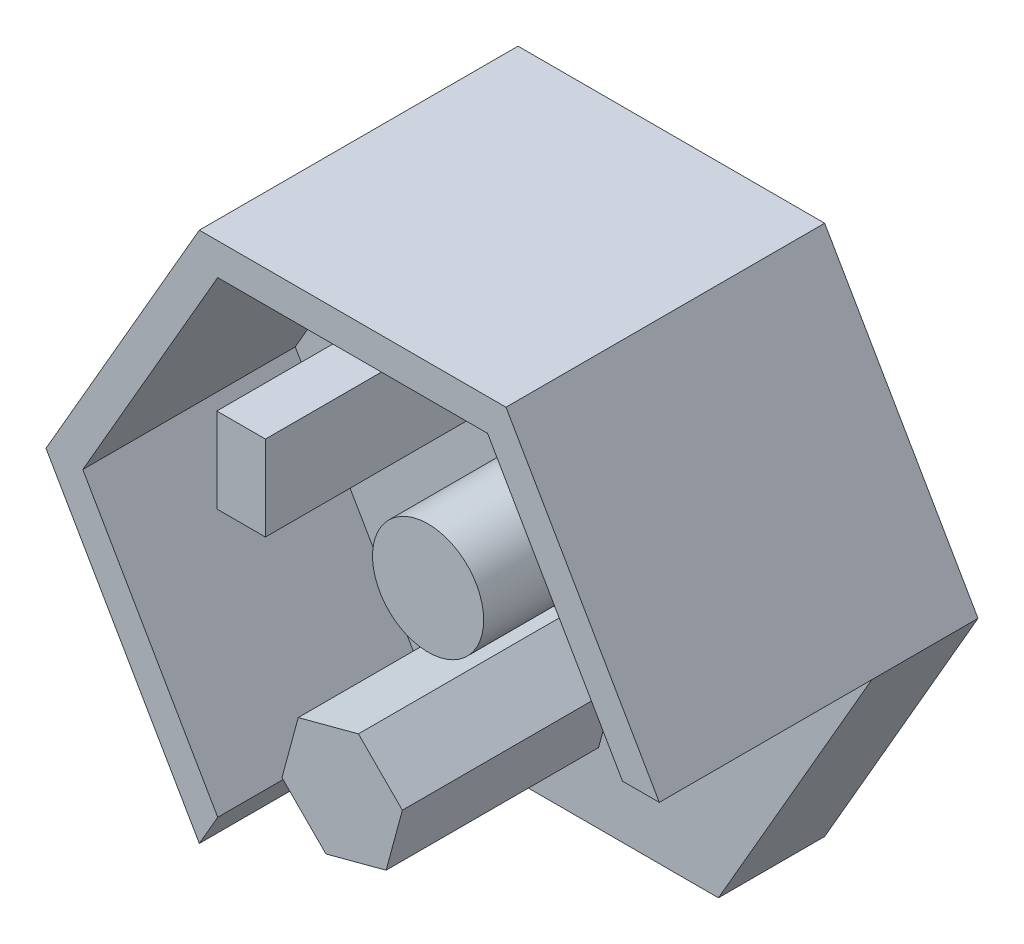
ISO-10303-21;
HEADER;
FILE_DESCRIPTION(('STEP AP214'),'2;1');
FILE_NAME('part.step','',(''),(''),'','','');
FILE_SCHEMA(('AUTOMOTIVE_DESIGN { 1 0 10303 214 1 1 1 1 }'));
ENDSEC;
DATA;
#1=APPLICATION_CONTEXT('core data for automotive mechanical design processes');
#2=APPLICATION_PROTOCOL_DEFINITION('international standard','automotive_design',2000,#1);
#3=PRODUCT_CONTEXT('',#1,'mechanical');
#4=PRODUCT('Part','Part','',(#3));
#5=PRODUCT_RELATED_PRODUCT_CATEGORY('part','',(#4));
#6=PRODUCT_DEFINITION_FORMATION('','',#4);
#7=PRODUCT_DEFINITION_CONTEXT('part definition',#1,'design');
#8=PRODUCT_DEFINITION('design','',#6,#7);
#9=PRODUCT_DEFINITION_SHAPE('','',#8);
#10=(LENGTH_UNIT() NAMED_UNIT(*) SI_UNIT(.MILLI.,.METRE.));
#11=(NAMED_UNIT(*) PLANE_ANGLE_UNIT() SI_UNIT($,.RADIAN.));
#12=(NAMED_UNIT(*) SI_UNIT($,.STERADIAN.) SOLID_ANGLE_UNIT());
#13=UNCERTAINTY_MEASURE_WITH_UNIT(LENGTH_MEASURE(1.E-05),#10,'distance_accuracy_value','');
#14=(GEOMETRIC_REPRESENTATION_CONTEXT(3) GLOBAL_UNCERTAINTY_ASSIGNED_CONTEXT((#13)) GLOBAL_UNIT_ASSIGNED_CONTEXT((#10,
#11,#12)) REPRESENTATION_CONTEXT('',''));
#15=CARTESIAN_POINT('',(0.,0.,0.));
#16=DIRECTION('',(0.,0.,1.));
#17=DIRECTION('',(1.,0.,0.));
#18=AXIS2_PLACEMENT_3D('',#15,#16,#17);
#19=CARTESIAN_POINT('',(0.,0.,100.));
#20=DIRECTION('',(0.,0.,1.));
#21=DIRECTION('',(1.,0.,0.));
#22=AXIS2_PLACEMENT_3D('',#19,#20,#21);
#23=PLANE('',#22);
#24=CARTESIAN_POINT('',(71.0000417790297,65.9084327447204,100.));
#25=DIRECTION('',(0.,0.,1.));
#26=DIRECTION('',(1.,0.,0.));
#27=AXIS2_PLACEMENT_3D('',#24,#25,#26);
#28=CIRCLE('',#27,52.3235089728572);
#29=CARTESIAN_POINT('',(123.323550751887,65.9084327447204,100.));
#30=VERTEX_POINT('',#29);
#31=EDGE_CURVE('E239',#30,#30,#28,.T.);
#32=ORIENTED_EDGE('',*,*,#31,.F.);
#33=EDGE_LOOP('',(#32));
#34=FACE_BOUND('',#33,.T.);
#35=DIRECTION('',(1.,0.,0.));
#36=VECTOR('',#35,1.);
#37=CARTESIAN_POINT('',(288.675134594813,0.,100.));
#38=LINE('',#37,#36);
#39=CARTESIAN_POINT('',(254.034118443435,0.,100.));
#40=VERTEX_POINT('',#39);
#41=CARTESIAN_POINT('',(288.675134594813,0.,100.));
#42=VERTEX_POINT('',#41);
#43=EDGE_CURVE('E246',#40,#42,#38,.T.);
#44=ORIENTED_EDGE('',*,*,#43,.F.);
#45=DIRECTION('',(-0.5,0.866025403784439,0.));
#46=VECTOR('',#45,1.);
#47=CARTESIAN_POINT('',(254.034118443435,0.,100.));
#48=LINE('',#47,#46);
#49=CARTESIAN_POINT('',(127.017059221718,220.,100.));
#50=VERTEX_POINT('',#49);
#51=EDGE_CURVE('E259',#40,#50,#48,.T.);
#52=ORIENTED_EDGE('',*,*,#51,.T.);
#53=DIRECTION('',(-1.,0.,0.));
#54=VECTOR('',#53,1.);
#55=CARTESIAN_POINT('',(127.017059221718,220.,100.));
#56=LINE('',#55,#54);
#57=CARTESIAN_POINT('',(-127.017059221718,220.,100.));
#58=VERTEX_POINT('',#57);
#59=EDGE_CURVE('E262',#50,#58,#56,.T.);
#60=ORIENTED_EDGE('',*,*,#59,.T.);
#61=DIRECTION('',(-0.5,-0.866025403784439,0.));
#62=VECTOR('',#61,1.);
#63=CARTESIAN_POINT('',(-127.017059221718,220.,100.));
#64=LINE('',#63,#62);
#65=CARTESIAN_POINT('',(-254.034118443435,-1.14350663860285E-13,100.));
#66=VERTEX_POINT('',#65);
#67=EDGE_CURVE('E266',#58,#66,#64,.T.);
#68=ORIENTED_EDGE('',*,*,#67,.T.);
#69=DIRECTION('',(0.5,-0.866025403784438,0.));
#70=VECTOR('',#69,1.);
#71=CARTESIAN_POINT('',(-254.034118443435,-1.14350663860285E-13,100.));
#72=LINE('',#71,#70);
#73=CARTESIAN_POINT('',(-127.017059221718,-220.,100.));
#74=VERTEX_POINT('',#73);
#75=EDGE_CURVE('E269',#66,#74,#72,.T.);
#76=ORIENTED_EDGE('',*,*,#75,.T.);
#77=DIRECTION('',(0.500000000000002,0.866025403784438,0.));
#78=VECTOR('',#77,1.);
#79=CARTESIAN_POINT('',(-127.017059221718,-220.,100.));
#80=LINE('',#79,#78);
#81=CARTESIAN_POINT('',(-144.337567297406,-250.,100.));
#82=VERTEX_POINT('',#81);
#83=EDGE_CURVE('E249',#82,#74,#80,.T.);
#84=ORIENTED_EDGE('',*,*,#83,.F.);
#85=DIRECTION('',(1.,0.,0.));
#86=VECTOR('',#85,1.);
#87=CARTESIAN_POINT('',(-144.337567297406,-250.,100.));
#88=LINE('',#87,#86);
#89=CARTESIAN_POINT('',(144.337567297406,-250.,100.));
#90=VERTEX_POINT('',#89);
#91=EDGE_CURVE('E256',#82,#90,#88,.T.);
#92=ORIENTED_EDGE('',*,*,#91,.T.);
#93=DIRECTION('',(0.5,0.866025403784439,0.));
#94=VECTOR('',#93,1.);
#95=CARTESIAN_POINT('',(144.337567297406,-250.,100.));
#96=LINE('',#95,#94);
#97=EDGE_CURVE('E254',#90,#42,#96,.T.);
#98=ORIENTED_EDGE('',*,*,#97,.T.);
#99=EDGE_LOOP('',(#44,#52,#60,#68,#76,#84,#92,#98));
#100=FACE_BOUND('',#99,.T.);
#101=DIRECTION('',(1.,0.,0.));
#102=VECTOR('',#101,1.);
#103=CARTESIAN_POINT('',(-127.873499512191,30.923794962689,100.));
#104=LINE('',#103,#102);
#105=CARTESIAN_POINT('',(-127.873499512191,30.923794962689,100.));
#106=VERTEX_POINT('',#105);
#107=CARTESIAN_POINT('',(-82.0971253509697,30.923794962689,100.));
#108=VERTEX_POINT('',#107);
#109=EDGE_CURVE('E210',#106,#108,#104,.T.);
#110=ORIENTED_EDGE('',*,*,#109,.F.);
#111=DIRECTION('',(0.,-1.,0.));
#112=VECTOR('',#111,1.);
#113=CARTESIAN_POINT('',(-127.873499512191,110.807978067157,100.));
#114=LINE('',#113,#112);
#115=CARTESIAN_POINT('',(-127.873499512191,110.807978067157,100.));
#116=VERTEX_POINT('',#115);
#117=EDGE_CURVE('E207',#116,#106,#114,.T.);
#118=ORIENTED_EDGE('',*,*,#117,.F.);
#119=DIRECTION('',(-1.,0.,0.));
#120=VECTOR('',#119,1.);
#121=CARTESIAN_POINT('',(-127.873499512191,110.807978067157,100.));
#122=LINE('',#121,#120);
#123=CARTESIAN_POINT('',(-82.0971253509697,110.807978067157,100.));
#124=VERTEX_POINT('',#123);
#125=EDGE_CURVE('E220',#124,#116,#122,.T.);
#126=ORIENTED_EDGE('',*,*,#125,.F.);
#127=DIRECTION('',(0.,1.,0.));
#128=VECTOR('',#127,1.);
#129=CARTESIAN_POINT('',(-82.0971253509697,110.807978067157,100.));
#130=LINE('',#129,#128);
#131=EDGE_CURVE('E228',#108,#124,#130,.T.);
#132=ORIENTED_EDGE('',*,*,#131,.F.);
#133=EDGE_LOOP('',(#110,#118,#126,#132));
#134=FACE_BOUND('',#133,.T.);
#135=DIRECTION('',(-0.705639752600897,0.708570772435149,0.));
#136=VECTOR('',#135,1.);
#137=CARTESIAN_POINT('',(46.7934129051172,-127.309552180406,100.));
#138=LINE('',#137,#136);
#139=CARTESIAN_POINT('',(46.7934129051172,-127.309552180406,100.));
#140=VERTEX_POINT('',#139);
#141=CARTESIAN_POINT('',(5.42018583280671,-85.7644729006359,100.));
#142=VERTEX_POINT('',#141);
#143=EDGE_CURVE('E628',#140,#142,#138,.T.);
#144=ORIENTED_EDGE('',*,*,#143,.F.);
#145=DIRECTION('',(0.260820413007553,0.965387337890118,0.));
#146=VECTOR('',#145,1.);
#147=CARTESIAN_POINT('',(31.5009323827527,-183.912357501455,100.));
#148=LINE('',#147,#146);
#149=CARTESIAN_POINT('',(31.5009323827527,-183.912357501455,100.));
#150=VERTEX_POINT('',#149);
#151=EDGE_CURVE('E205',#150,#140,#148,.T.);
#152=ORIENTED_EDGE('',*,*,#151,.F.);
#153=DIRECTION('',(0.96646016560845,0.256816565454969,0.));
#154=VECTOR('',#153,1.);
#155=CARTESIAN_POINT('',(-25.1647752119221,-198.970083542732,100.));
#156=LINE('',#155,#154);
#157=CARTESIAN_POINT('',(-25.1647752119222,-198.970083542732,100.));
#158=VERTEX_POINT('',#157);
#159=EDGE_CURVE('E201',#158,#150,#156,.T.);
#160=ORIENTED_EDGE('',*,*,#159,.F.);
#161=DIRECTION('',(0.705639752600898,-0.708570772435149,0.));
#162=VECTOR('',#161,1.);
#163=CARTESIAN_POINT('',(-66.5380022842327,-157.425004262962,100.));
#164=LINE('',#163,#162);
#165=CARTESIAN_POINT('',(-66.5380022842327,-157.425004262962,100.));
#166=VERTEX_POINT('',#165);
#167=EDGE_CURVE('E624',#166,#158,#164,.T.);
#168=ORIENTED_EDGE('',*,*,#167,.F.);
#169=DIRECTION('',(-0.260820413007553,-0.965387337890118,0.));
#170=VECTOR('',#169,1.);
#171=CARTESIAN_POINT('',(-51.2455217618682,-100.822198941914,100.));
#172=LINE('',#171,#170);
#173=CARTESIAN_POINT('',(-51.2455217618682,-100.822198941914,100.));
#174=VERTEX_POINT('',#173);
#175=EDGE_CURVE('E636',#174,#166,#172,.T.);
#176=ORIENTED_EDGE('',*,*,#175,.F.);
#177=DIRECTION('',(-0.966460165608451,-0.256816565454969,0.));
#178=VECTOR('',#177,1.);
#179=CARTESIAN_POINT('',(5.42018583280671,-85.7644729006359,100.));
#180=LINE('',#179,#178);
#181=EDGE_CURVE('E630',#142,#174,#180,.T.);
#182=ORIENTED_EDGE('',*,*,#181,.F.);
#183=EDGE_LOOP('',(#144,#152,#160,#168,#176,#182));
#184=FACE_BOUND('',#183,.T.);
#185=ADVANCED_FACE('F33',(#34,#100,#134,#184),#23,.T.);
#186=CARTESIAN_POINT('',(-144.337567297406,-250.,300.));
#187=DIRECTION('',(0.,1.,0.));
#188=DIRECTION('',(0.,0.,1.));
#189=AXIS2_PLACEMENT_3D('',#186,#187,#188);
#190=PLANE('',#189);
#191=ORIENTED_EDGE('',*,*,#91,.F.);
#192=DIRECTION('',(0.,0.,-1.));
#193=VECTOR('',#192,1.);
#194=CARTESIAN_POINT('',(-144.337567297406,-250.,300.));
#195=LINE('',#194,#193);
#196=CARTESIAN_POINT('',(-144.337567297406,-250.,0.));
#197=VERTEX_POINT('',#196);
#198=EDGE_CURVE('E304',#82,#197,#195,.T.);
#199=ORIENTED_EDGE('',*,*,#198,.T.);
#200=DIRECTION('',(1.,0.,0.));
#201=VECTOR('',#200,1.);
#202=CARTESIAN_POINT('',(-144.337567297406,-250.,0.));
#203=LINE('',#202,#201);
#204=CARTESIAN_POINT('',(144.337567297406,-250.,0.));
#205=VERTEX_POINT('',#204);
#206=EDGE_CURVE('E285',#197,#205,#203,.T.);
#207=ORIENTED_EDGE('',*,*,#206,.T.);
#208=DIRECTION('',(0.,0.,-1.));
#209=VECTOR('',#208,1.);
#210=CARTESIAN_POINT('',(144.337567297406,-250.,300.));
#211=LINE('',#210,#209);
#212=EDGE_CURVE('E11',#90,#205,#211,.T.);
#213=ORIENTED_EDGE('',*,*,#212,.F.);
#214=EDGE_LOOP('',(#191,#199,#207,#213));
#215=FACE_BOUND('',#214,.T.);
#216=ADVANCED_FACE('F35',(#215),#190,.F.);
#217=CARTESIAN_POINT('',(144.337567297406,-250.,300.));
#218=DIRECTION('',(-0.866025403784438,0.5,0.));
#219=DIRECTION('',(-0.5,-0.866025403784439,0.));
#220=AXIS2_PLACEMENT_3D('',#217,#218,#219);
#221=PLANE('',#220);
#222=ORIENTED_EDGE('',*,*,#97,.F.);
#223=ORIENTED_EDGE('',*,*,#212,.T.);
#224=DIRECTION('',(0.5,0.866025403784438,0.));
#225=VECTOR('',#224,1.);
#226=CARTESIAN_POINT('',(144.337567297406,-250.,0.));
#227=LINE('',#226,#225);
#228=CARTESIAN_POINT('',(288.675134594813,0.,0.));
#229=VERTEX_POINT('',#228);
#230=EDGE_CURVE('E307',#205,#229,#227,.T.);
#231=ORIENTED_EDGE('',*,*,#230,.T.);
#232=DIRECTION('',(0.,0.,-1.));
#233=VECTOR('',#232,1.);
#234=CARTESIAN_POINT('',(288.675134594813,0.,300.));
#235=LINE('',#234,#233);
#236=EDGE_CURVE('E328',#42,#229,#235,.T.);
#237=ORIENTED_EDGE('',*,*,#236,.F.);
#238=EDGE_LOOP('',(#222,#223,#231,#237));
#239=FACE_BOUND('',#238,.T.);
#240=ADVANCED_FACE('F339',(#239),#221,.F.);
#241=CARTESIAN_POINT('',(288.675134594813,0.,300.));
#242=DIRECTION('',(-0.866025403784438,-0.5,0.));
#243=DIRECTION('',(0.5,-0.866025403784439,0.));
#244=AXIS2_PLACEMENT_3D('',#241,#242,#243);
#245=PLANE('',#244);
#246=DIRECTION('',(-0.5,0.866025403784438,0.));
#247=VECTOR('',#246,1.);
#248=CARTESIAN_POINT('',(288.675134594813,0.,0.));
#249=LINE('',#248,#247);
#250=CARTESIAN_POINT('',(144.337567297406,250.,0.));
#251=VERTEX_POINT('',#250);
#252=EDGE_CURVE('E310',#229,#251,#249,.T.);
#253=ORIENTED_EDGE('',*,*,#252,.T.);
#254=DIRECTION('',(0.,0.,-1.));
#255=VECTOR('',#254,1.);
#256=CARTESIAN_POINT('',(144.337567297406,250.,300.));
#257=LINE('',#256,#255);
#258=CARTESIAN_POINT('',(144.337567297406,250.,300.));
#259=VERTEX_POINT('',#258);
#260=EDGE_CURVE('E326',#259,#251,#257,.T.);
#261=ORIENTED_EDGE('',*,*,#260,.F.);
#262=DIRECTION('',(-0.5,0.866025403784438,0.));
#263=VECTOR('',#262,1.);
#264=CARTESIAN_POINT('',(288.675134594813,0.,300.));
#265=LINE('',#264,#263);
#266=CARTESIAN_POINT('',(288.675134594813,0.,300.));
#267=VERTEX_POINT('',#266);
#268=EDGE_CURVE('E294',#267,#259,#265,.T.);
#269=ORIENTED_EDGE('',*,*,#268,.F.);
#270=EDGE_CURVE('E41',#267,#42,#235,.T.);
#271=ORIENTED_EDGE('',*,*,#270,.T.);
#272=ORIENTED_EDGE('',*,*,#236,.T.);
#273=EDGE_LOOP('',(#253,#261,#269,#271,#272));
#274=FACE_BOUND('',#273,.T.);
#275=ADVANCED_FACE('F333',(#274),#245,.F.);
#276=CARTESIAN_POINT('',(144.337567297406,250.,300.));
#277=DIRECTION('',(0.,-1.,0.));
#278=DIRECTION('',(1.,0.,0.));
#279=AXIS2_PLACEMENT_3D('',#276,#277,#278);
#280=PLANE('',#279);
#281=DIRECTION('',(-1.,0.,0.));
#282=VECTOR('',#281,1.);
#283=CARTESIAN_POINT('',(144.337567297406,250.,0.));
#284=LINE('',#283,#282);
#285=CARTESIAN_POINT('',(-144.337567297406,250.,0.));
#286=VERTEX_POINT('',#285);
#287=EDGE_CURVE('E312',#251,#286,#284,.T.);
#288=ORIENTED_EDGE('',*,*,#287,.T.);
#289=DIRECTION('',(0.,0.,-1.));
#290=VECTOR('',#289,1.);
#291=CARTESIAN_POINT('',(-144.337567297406,250.,300.));
#292=LINE('',#291,#290);
#293=CARTESIAN_POINT('',(-144.337567297406,250.,300.));
#294=VERTEX_POINT('',#293);
#295=EDGE_CURVE('E323',#294,#286,#292,.T.);
#296=ORIENTED_EDGE('',*,*,#295,.F.);
#297=DIRECTION('',(-1.,0.,0.));
#298=VECTOR('',#297,1.);
#299=CARTESIAN_POINT('',(144.337567297406,250.,300.));
#300=LINE('',#299,#298);
#301=EDGE_CURVE('E296',#259,#294,#300,.T.);
#302=ORIENTED_EDGE('',*,*,#301,.F.);
#303=ORIENTED_EDGE('',*,*,#260,.T.);
#304=EDGE_LOOP('',(#288,#296,#302,#303));
#305=FACE_BOUND('',#304,.T.);
#306=ADVANCED_FACE('F349',(#305),#280,.F.);
#307=CARTESIAN_POINT('',(-144.337567297406,250.,300.));
#308=DIRECTION('',(0.866025403784439,-0.5,0.));
#309=DIRECTION('',(0.5,0.866025403784439,0.));
#310=AXIS2_PLACEMENT_3D('',#307,#308,#309);
#311=PLANE('',#310);
#312=DIRECTION('',(-0.5,-0.866025403784439,0.));
#313=VECTOR('',#312,1.);
#314=CARTESIAN_POINT('',(-144.337567297406,250.,0.));
#315=LINE('',#314,#313);
#316=CARTESIAN_POINT('',(-288.675134594813,0.,0.));
#317=VERTEX_POINT('',#316);
#318=EDGE_CURVE('E314',#286,#317,#315,.T.);
#319=ORIENTED_EDGE('',*,*,#318,.T.);
#320=DIRECTION('',(0.,0.,-1.));
#321=VECTOR('',#320,1.);
#322=CARTESIAN_POINT('',(-288.675134594813,0.,300.));
#323=LINE('',#322,#321);
#324=CARTESIAN_POINT('',(-288.675134594813,0.,300.));
#325=VERTEX_POINT('',#324);
#326=EDGE_CURVE('E320',#325,#317,#323,.T.);
#327=ORIENTED_EDGE('',*,*,#326,.F.);
#328=DIRECTION('',(-0.5,-0.866025403784439,0.));
#329=VECTOR('',#328,1.);
#330=CARTESIAN_POINT('',(-144.337567297406,250.,300.));
#331=LINE('',#330,#329);
#332=EDGE_CURVE('E299',#294,#325,#331,.T.);
#333=ORIENTED_EDGE('',*,*,#332,.F.);
#334=ORIENTED_EDGE('',*,*,#295,.T.);
#335=EDGE_LOOP('',(#319,#327,#333,#334));
#336=FACE_BOUND('',#335,.T.);
#337=ADVANCED_FACE('F353',(#336),#311,.F.);
#338=CARTESIAN_POINT('',(-288.675134594813,0.,300.));
#339=DIRECTION('',(0.866025403784438,0.5,0.));
#340=DIRECTION('',(-0.5,0.866025403784439,0.));
#341=AXIS2_PLACEMENT_3D('',#338,#339,#340);
#342=PLANE('',#341);
#343=DIRECTION('',(0.5,-0.866025403784438,0.));
#344=VECTOR('',#343,1.);
#345=CARTESIAN_POINT('',(-288.675134594813,0.,0.));
#346=LINE('',#345,#344);
#347=EDGE_CURVE('E297',#317,#197,#346,.T.);
#348=ORIENTED_EDGE('',*,*,#347,.T.);
#349=ORIENTED_EDGE('',*,*,#198,.F.);
#350=CARTESIAN_POINT('',(-144.337567297406,-250.,300.));
#351=VERTEX_POINT('',#350);
#352=EDGE_CURVE('E318',#351,#82,#195,.T.);
#353=ORIENTED_EDGE('',*,*,#352,.F.);
#354=DIRECTION('',(0.5,-0.866025403784438,0.));
#355=VECTOR('',#354,1.);
#356=CARTESIAN_POINT('',(-288.675134594813,0.,300.));
#357=LINE('',#356,#355);
#358=EDGE_CURVE('E301',#325,#351,#357,.T.);
#359=ORIENTED_EDGE('',*,*,#358,.F.);
#360=ORIENTED_EDGE('',*,*,#326,.T.);
#361=EDGE_LOOP('',(#348,#349,#353,#359,#360));
#362=FACE_BOUND('',#361,.T.);
#363=ADVANCED_FACE('F377',(#362),#342,.F.);
#364=CARTESIAN_POINT('',(0.,0.,300.));
#365=DIRECTION('',(0.,0.,1.));
#366=DIRECTION('',(1.,0.,0.));
#367=AXIS2_PLACEMENT_3D('',#364,#365,#366);
#368=PLANE('',#367);
#369=DIRECTION('',(-1.,0.,0.));
#370=VECTOR('',#369,1.);
#371=CARTESIAN_POINT('',(288.675134594813,0.,300.));
#372=LINE('',#371,#370);
#373=CARTESIAN_POINT('',(254.034118443435,0.,300.));
#374=VERTEX_POINT('',#373);
#375=EDGE_CURVE('E250',#267,#374,#372,.T.);
#376=ORIENTED_EDGE('',*,*,#375,.F.);
#377=ORIENTED_EDGE('',*,*,#268,.T.);
#378=ORIENTED_EDGE('',*,*,#301,.T.);
#379=ORIENTED_EDGE('',*,*,#332,.T.);
#380=ORIENTED_EDGE('',*,*,#358,.T.);
#381=DIRECTION('',(-0.500000000000002,-0.866025403784437,0.));
#382=VECTOR('',#381,1.);
#383=CARTESIAN_POINT('',(-127.017059221718,-220.,300.));
#384=LINE('',#383,#382);
#385=CARTESIAN_POINT('',(-127.017059221718,-220.,300.));
#386=VERTEX_POINT('',#385);
#387=EDGE_CURVE('E243',#386,#351,#384,.T.);
#388=ORIENTED_EDGE('',*,*,#387,.F.);
#389=DIRECTION('',(0.5,-0.866025403784438,0.));
#390=VECTOR('',#389,1.);
#391=CARTESIAN_POINT('',(-254.034118443435,-1.14350663860285E-13,300.));
#392=LINE('',#391,#390);
#393=CARTESIAN_POINT('',(-254.034118443435,-1.14350663860285E-13,300.));
#394=VERTEX_POINT('',#393);
#395=EDGE_CURVE('E263',#394,#386,#392,.T.);
#396=ORIENTED_EDGE('',*,*,#395,.F.);
#397=DIRECTION('',(-0.5,-0.866025403784439,0.));
#398=VECTOR('',#397,1.);
#399=CARTESIAN_POINT('',(-127.017059221718,220.,300.));
#400=LINE('',#399,#398);
#401=CARTESIAN_POINT('',(-127.017059221718,220.,300.));
#402=VERTEX_POINT('',#401);
#403=EDGE_CURVE('E278',#402,#394,#400,.T.);
#404=ORIENTED_EDGE('',*,*,#403,.F.);
#405=DIRECTION('',(-1.,0.,0.));
#406=VECTOR('',#405,1.);
#407=CARTESIAN_POINT('',(127.017059221718,220.,300.));
#408=LINE('',#407,#406);
#409=CARTESIAN_POINT('',(127.017059221718,220.,300.));
#410=VERTEX_POINT('',#409);
#411=EDGE_CURVE('E275',#410,#402,#408,.T.);
#412=ORIENTED_EDGE('',*,*,#411,.F.);
#413=DIRECTION('',(-0.5,0.866025403784439,0.));
#414=VECTOR('',#413,1.);
#415=CARTESIAN_POINT('',(254.034118443435,0.,300.));
#416=LINE('',#415,#414);
#417=EDGE_CURVE('E258',#374,#410,#416,.T.);
#418=ORIENTED_EDGE('',*,*,#417,.F.);
#419=EDGE_LOOP('',(#376,#377,#378,#379,#380,#388,#396,#404,#412,#418));
#420=FACE_BOUND('',#419,.T.);
#421=ADVANCED_FACE('F358',(#420),#368,.T.);
#422=CARTESIAN_POINT('',(0.,0.,0.));
#423=DIRECTION('',(0.,0.,1.));
#424=DIRECTION('',(1.,0.,0.));
#425=AXIS2_PLACEMENT_3D('',#422,#423,#424);
#426=PLANE('',#425);
#427=ORIENTED_EDGE('',*,*,#206,.F.);
#428=ORIENTED_EDGE('',*,*,#347,.F.);
#429=ORIENTED_EDGE('',*,*,#318,.F.);
#430=ORIENTED_EDGE('',*,*,#287,.F.);
#431=ORIENTED_EDGE('',*,*,#252,.F.);
#432=ORIENTED_EDGE('',*,*,#230,.F.);
#433=EDGE_LOOP('',(#427,#428,#429,#430,#431,#432));
#434=FACE_BOUND('',#433,.T.);
#435=ADVANCED_FACE('F344',(#434),#426,.F.);
#436=CARTESIAN_POINT('',(-254.034118443435,-1.14350663860285E-13,100.));
#437=DIRECTION('',(-0.866025403784438,-0.5,0.));
#438=DIRECTION('',(0.5,-0.866025403784438,0.));
#439=AXIS2_PLACEMENT_3D('',#436,#437,#438);
#440=PLANE('',#439);
#441=ORIENTED_EDGE('',*,*,#395,.T.);
#442=DIRECTION('',(0.,0.,1.));
#443=VECTOR('',#442,1.);
#444=CARTESIAN_POINT('',(-127.017059221718,-220.,100.));
#445=LINE('',#444,#443);
#446=EDGE_CURVE('E283',#74,#386,#445,.T.);
#447=ORIENTED_EDGE('',*,*,#446,.F.);
#448=ORIENTED_EDGE('',*,*,#75,.F.);
#449=DIRECTION('',(0.,0.,1.));
#450=VECTOR('',#449,1.);
#451=CARTESIAN_POINT('',(-254.034118443435,-1.14350663860285E-13,100.));
#452=LINE('',#451,#450);
#453=EDGE_CURVE('E286',#66,#394,#452,.T.);
#454=ORIENTED_EDGE('',*,*,#453,.T.);
#455=EDGE_LOOP('',(#441,#447,#448,#454));
#456=FACE_BOUND('',#455,.T.);
#457=ADVANCED_FACE('F384',(#456),#440,.F.);
#458=CARTESIAN_POINT('',(-127.017059221718,220.,100.));
#459=DIRECTION('',(-0.866025403784439,0.5,0.));
#460=DIRECTION('',(-0.5,-0.866025403784439,0.));
#461=AXIS2_PLACEMENT_3D('',#458,#459,#460);
#462=PLANE('',#461);
#463=ORIENTED_EDGE('',*,*,#403,.T.);
#464=ORIENTED_EDGE('',*,*,#453,.F.);
#465=ORIENTED_EDGE('',*,*,#67,.F.);
#466=DIRECTION('',(0.,0.,1.));
#467=VECTOR('',#466,1.);
#468=CARTESIAN_POINT('',(-127.017059221718,220.,100.));
#469=LINE('',#468,#467);
#470=EDGE_CURVE('E288',#58,#402,#469,.T.);
#471=ORIENTED_EDGE('',*,*,#470,.T.);
#472=EDGE_LOOP('',(#463,#464,#465,#471));
#473=FACE_BOUND('',#472,.T.);
#474=ADVANCED_FACE('F388',(#473),#462,.F.);
#475=CARTESIAN_POINT('',(127.017059221718,220.,100.));
#476=DIRECTION('',(0.,1.,0.));
#477=DIRECTION('',(-1.,0.,0.));
#478=AXIS2_PLACEMENT_3D('',#475,#476,#477);
#479=PLANE('',#478);
#480=ORIENTED_EDGE('',*,*,#411,.T.);
#481=ORIENTED_EDGE('',*,*,#470,.F.);
#482=ORIENTED_EDGE('',*,*,#59,.F.);
#483=DIRECTION('',(0.,0.,1.));
#484=VECTOR('',#483,1.);
#485=CARTESIAN_POINT('',(127.017059221718,220.,100.));
#486=LINE('',#485,#484);
#487=EDGE_CURVE('E290',#50,#410,#486,.T.);
#488=ORIENTED_EDGE('',*,*,#487,.T.);
#489=EDGE_LOOP('',(#480,#481,#482,#488));
#490=FACE_BOUND('',#489,.T.);
#491=ADVANCED_FACE('F390',(#490),#479,.F.);
#492=CARTESIAN_POINT('',(254.034118443435,0.,100.));
#493=DIRECTION('',(0.866025403784439,0.5,0.));
#494=DIRECTION('',(-0.5,0.866025403784439,0.));
#495=AXIS2_PLACEMENT_3D('',#492,#493,#494);
#496=PLANE('',#495);
#497=ORIENTED_EDGE('',*,*,#417,.T.);
#498=ORIENTED_EDGE('',*,*,#487,.F.);
#499=ORIENTED_EDGE('',*,*,#51,.F.);
#500=DIRECTION('',(0.,0.,1.));
#501=VECTOR('',#500,1.);
#502=CARTESIAN_POINT('',(254.034118443435,0.,100.));
#503=LINE('',#502,#501);
#504=EDGE_CURVE('E272',#40,#374,#503,.T.);
#505=ORIENTED_EDGE('',*,*,#504,.T.);
#506=EDGE_LOOP('',(#497,#498,#499,#505));
#507=FACE_BOUND('',#506,.T.);
#508=ADVANCED_FACE('F368',(#507),#496,.F.);
#509=CARTESIAN_POINT('',(288.675134594813,0.,-808.617343620538));
#510=DIRECTION('',(0.,1.,0.));
#511=DIRECTION('',(-1.,0.,0.));
#512=AXIS2_PLACEMENT_3D('',#509,#510,#511);
#513=PLANE('',#512);
#514=ORIENTED_EDGE('',*,*,#43,.T.);
#515=ORIENTED_EDGE('',*,*,#270,.F.);
#516=ORIENTED_EDGE('',*,*,#375,.T.);
#517=ORIENTED_EDGE('',*,*,#504,.F.);
#518=EDGE_LOOP('',(#514,#515,#516,#517));
#519=FACE_BOUND('',#518,.T.);
#520=ADVANCED_FACE('F365',(#519),#513,.F.);
#521=CARTESIAN_POINT('',(-127.017059221718,-220.,-808.617343620538));
#522=DIRECTION('',(-0.866025403784437,0.500000000000002,0.));
#523=DIRECTION('',(-0.500000000000002,-0.866025403784438,0.));
#524=AXIS2_PLACEMENT_3D('',#521,#522,#523);
#525=PLANE('',#524);
#526=ORIENTED_EDGE('',*,*,#83,.T.);
#527=ORIENTED_EDGE('',*,*,#446,.T.);
#528=ORIENTED_EDGE('',*,*,#387,.T.);
#529=ORIENTED_EDGE('',*,*,#352,.T.);
#530=EDGE_LOOP('',(#526,#527,#528,#529));
#531=FACE_BOUND('',#530,.T.);
#532=ADVANCED_FACE('F379',(#531),#525,.F.);
#533=CARTESIAN_POINT('',(71.0000417790297,65.9084327447204,300.));
#534=DIRECTION('',(0.,0.,-1.));
#535=DIRECTION('',(-1.,0.,0.));
#536=AXIS2_PLACEMENT_3D('',#533,#534,#535);
#537=CYLINDRICAL_SURFACE('',#536,52.3235089728572);
#538=CARTESIAN_POINT('',(71.0000417790297,65.9084327447204,300.));
#539=DIRECTION('',(0.,0.,1.));
#540=DIRECTION('',(1.,0.,0.));
#541=AXIS2_PLACEMENT_3D('',#538,#539,#540);
#542=CIRCLE('',#541,52.3235089728572);
#543=CARTESIAN_POINT('',(123.323550751887,65.9084327447204,300.));
#544=VERTEX_POINT('',#543);
#545=EDGE_CURVE('E240',#544,#544,#542,.T.);
#546=ORIENTED_EDGE('',*,*,#545,.F.);
#547=EDGE_LOOP('',(#546));
#548=FACE_BOUND('',#547,.T.);
#549=ORIENTED_EDGE('',*,*,#31,.T.);
#550=EDGE_LOOP('',(#549));
#551=FACE_BOUND('',#550,.T.);
#552=ADVANCED_FACE('F481',(#548,#551),#537,.T.);
#553=CARTESIAN_POINT('',(71.0000417790297,65.9084327447204,300.));
#554=DIRECTION('',(0.,0.,1.));
#555=DIRECTION('',(1.,0.,0.));
#556=AXIS2_PLACEMENT_3D('',#553,#554,#555);
#557=PLANE('',#556);
#558=ORIENTED_EDGE('',*,*,#545,.T.);
#559=EDGE_LOOP('',(#558));
#560=FACE_BOUND('',#559,.T.);
#561=ADVANCED_FACE('F489',(#560),#557,.T.);
#562=CARTESIAN_POINT('',(-127.873499512191,110.807978067157,300.));
#563=DIRECTION('',(1.,0.,0.));
#564=DIRECTION('',(0.,0.,-1.));
#565=AXIS2_PLACEMENT_3D('',#562,#563,#564);
#566=PLANE('',#565);
#567=ORIENTED_EDGE('',*,*,#117,.T.);
#568=DIRECTION('',(0.,0.,-1.));
#569=VECTOR('',#568,1.);
#570=CARTESIAN_POINT('',(-127.873499512191,30.923794962689,300.));
#571=LINE('',#570,#569);
#572=CARTESIAN_POINT('',(-127.873499512191,30.923794962689,300.));
#573=VERTEX_POINT('',#572);
#574=EDGE_CURVE('E237',#573,#106,#571,.T.);
#575=ORIENTED_EDGE('',*,*,#574,.F.);
#576=DIRECTION('',(0.,-1.,0.));
#577=VECTOR('',#576,1.);
#578=CARTESIAN_POINT('',(-127.873499512191,110.807978067157,300.));
#579=LINE('',#578,#577);
#580=CARTESIAN_POINT('',(-127.873499512191,110.807978067157,300.));
#581=VERTEX_POINT('',#580);
#582=EDGE_CURVE('E216',#581,#573,#579,.T.);
#583=ORIENTED_EDGE('',*,*,#582,.F.);
#584=DIRECTION('',(0.,0.,-1.));
#585=VECTOR('',#584,1.);
#586=CARTESIAN_POINT('',(-127.873499512191,110.807978067157,300.));
#587=LINE('',#586,#585);
#588=EDGE_CURVE('E225',#581,#116,#587,.T.);
#589=ORIENTED_EDGE('',*,*,#588,.T.);
#590=EDGE_LOOP('',(#567,#575,#583,#589));
#591=FACE_BOUND('',#590,.T.);
#592=ADVANCED_FACE('F499',(#591),#566,.F.);
#593=CARTESIAN_POINT('',(-127.873499512191,30.923794962689,300.));
#594=DIRECTION('',(0.,1.,0.));
#595=DIRECTION('',(0.,0.,1.));
#596=AXIS2_PLACEMENT_3D('',#593,#594,#595);
#597=PLANE('',#596);
#598=ORIENTED_EDGE('',*,*,#109,.T.);
#599=DIRECTION('',(0.,0.,-1.));
#600=VECTOR('',#599,1.);
#601=CARTESIAN_POINT('',(-82.0971253509697,30.923794962689,300.));
#602=LINE('',#601,#600);
#603=CARTESIAN_POINT('',(-82.0971253509697,30.923794962689,300.));
#604=VERTEX_POINT('',#603);
#605=EDGE_CURVE('E234',#604,#108,#602,.T.);
#606=ORIENTED_EDGE('',*,*,#605,.F.);
#607=DIRECTION('',(1.,0.,0.));
#608=VECTOR('',#607,1.);
#609=CARTESIAN_POINT('',(-127.873499512191,30.923794962689,300.));
#610=LINE('',#609,#608);
#611=EDGE_CURVE('E219',#573,#604,#610,.T.);
#612=ORIENTED_EDGE('',*,*,#611,.F.);
#613=ORIENTED_EDGE('',*,*,#574,.T.);
#614=EDGE_LOOP('',(#598,#606,#612,#613));
#615=FACE_BOUND('',#614,.T.);
#616=ADVANCED_FACE('F509',(#615),#597,.F.);
#617=CARTESIAN_POINT('',(-82.0971253509697,110.807978067157,300.));
#618=DIRECTION('',(-1.,0.,0.));
#619=DIRECTION('',(0.,0.,1.));
#620=AXIS2_PLACEMENT_3D('',#617,#618,#619);
#621=PLANE('',#620);
#622=ORIENTED_EDGE('',*,*,#131,.T.);
#623=DIRECTION('',(0.,0.,-1.));
#624=VECTOR('',#623,1.);
#625=CARTESIAN_POINT('',(-82.0971253509697,110.807978067157,300.));
#626=LINE('',#625,#624);
#627=CARTESIAN_POINT('',(-82.0971253509697,110.807978067157,300.));
#628=VERTEX_POINT('',#627);
#629=EDGE_CURVE('E56',#628,#124,#626,.T.);
#630=ORIENTED_EDGE('',*,*,#629,.F.);
#631=DIRECTION('',(0.,1.,0.));
#632=VECTOR('',#631,1.);
#633=CARTESIAN_POINT('',(-82.0971253509697,110.807978067157,300.));
#634=LINE('',#633,#632);
#635=EDGE_CURVE('E222',#604,#628,#634,.T.);
#636=ORIENTED_EDGE('',*,*,#635,.F.);
#637=ORIENTED_EDGE('',*,*,#605,.T.);
#638=EDGE_LOOP('',(#622,#630,#636,#637));
#639=FACE_BOUND('',#638,.T.);
#640=ADVANCED_FACE('F519',(#639),#621,.F.);
#641=CARTESIAN_POINT('',(-127.873499512191,110.807978067157,300.));
#642=DIRECTION('',(0.,-1.,0.));
#643=DIRECTION('',(0.,0.,-1.));
#644=AXIS2_PLACEMENT_3D('',#641,#642,#643);
#645=PLANE('',#644);
#646=ORIENTED_EDGE('',*,*,#125,.T.);
#647=ORIENTED_EDGE('',*,*,#588,.F.);
#648=DIRECTION('',(-1.,0.,0.));
#649=VECTOR('',#648,1.);
#650=CARTESIAN_POINT('',(-127.873499512191,110.807978067157,300.));
#651=LINE('',#650,#649);
#652=EDGE_CURVE('E224',#628,#581,#651,.T.);
#653=ORIENTED_EDGE('',*,*,#652,.F.);
#654=ORIENTED_EDGE('',*,*,#629,.T.);
#655=EDGE_LOOP('',(#646,#647,#653,#654));
#656=FACE_BOUND('',#655,.T.);
#657=ADVANCED_FACE('F529',(#656),#645,.F.);
#658=CARTESIAN_POINT('',(0.,0.,300.));
#659=DIRECTION('',(0.,0.,1.));
#660=DIRECTION('',(1.,0.,0.));
#661=AXIS2_PLACEMENT_3D('',#658,#659,#660);
#662=PLANE('',#661);
#663=ORIENTED_EDGE('',*,*,#582,.T.);
#664=ORIENTED_EDGE('',*,*,#611,.T.);
#665=ORIENTED_EDGE('',*,*,#635,.T.);
#666=ORIENTED_EDGE('',*,*,#652,.T.);
#667=EDGE_LOOP('',(#663,#664,#665,#666));
#668=FACE_BOUND('',#667,.T.);
#669=ADVANCED_FACE('F539',(#668),#662,.T.);
#670=CARTESIAN_POINT('',(31.5009323827527,-183.912357501455,300.));
#671=DIRECTION('',(-0.965387337890118,0.260820413007553,0.));
#672=DIRECTION('',(-0.260820413007553,-0.965387337890118,0.));
#673=AXIS2_PLACEMENT_3D('',#670,#671,#672);
#674=PLANE('',#673);
#675=ORIENTED_EDGE('',*,*,#151,.T.);
#676=DIRECTION('',(0.,0.,-1.));
#677=VECTOR('',#676,1.);
#678=CARTESIAN_POINT('',(46.7934129051172,-127.309552180406,300.));
#679=LINE('',#678,#677);
#680=CARTESIAN_POINT('',(46.7934129051172,-127.309552180406,300.));
#681=VERTEX_POINT('',#680);
#682=EDGE_CURVE('E186',#681,#140,#679,.T.);
#683=ORIENTED_EDGE('',*,*,#682,.F.);
#684=DIRECTION('',(0.260820413007553,0.965387337890118,0.));
#685=VECTOR('',#684,1.);
#686=CARTESIAN_POINT('',(31.5009323827527,-183.912357501455,300.));
#687=LINE('',#686,#685);
#688=CARTESIAN_POINT('',(31.5009323827527,-183.912357501455,300.));
#689=VERTEX_POINT('',#688);
#690=EDGE_CURVE('E193',#689,#681,#687,.T.);
#691=ORIENTED_EDGE('',*,*,#690,.F.);
#692=DIRECTION('',(0.,0.,-1.));
#693=VECTOR('',#692,1.);
#694=CARTESIAN_POINT('',(31.5009323827527,-183.912357501455,300.));
#695=LINE('',#694,#693);
#696=EDGE_CURVE('E621',#689,#150,#695,.T.);
#697=ORIENTED_EDGE('',*,*,#696,.T.);
#698=EDGE_LOOP('',(#675,#683,#691,#697));
#699=FACE_BOUND('',#698,.T.);
#700=ADVANCED_FACE('F203',(#699),#674,.F.);
#701=CARTESIAN_POINT('',(46.7934129051172,-127.309552180406,300.));
#702=DIRECTION('',(-0.708570772435149,-0.705639752600897,0.));
#703=DIRECTION('',(0.705639752600898,-0.708570772435149,0.));
#704=AXIS2_PLACEMENT_3D('',#701,#702,#703);
#705=PLANE('',#704);
#706=ORIENTED_EDGE('',*,*,#143,.T.);
#707=DIRECTION('',(0.,0.,-1.));
#708=VECTOR('',#707,1.);
#709=CARTESIAN_POINT('',(5.42018583280671,-85.7644729006359,300.));
#710=LINE('',#709,#708);
#711=CARTESIAN_POINT('',(5.42018583280671,-85.7644729006359,300.));
#712=VERTEX_POINT('',#711);
#713=EDGE_CURVE('E189',#712,#142,#710,.T.);
#714=ORIENTED_EDGE('',*,*,#713,.F.);
#715=DIRECTION('',(-0.705639752600897,0.708570772435149,0.));
#716=VECTOR('',#715,1.);
#717=CARTESIAN_POINT('',(46.7934129051172,-127.309552180406,300.));
#718=LINE('',#717,#716);
#719=EDGE_CURVE('E182',#681,#712,#718,.T.);
#720=ORIENTED_EDGE('',*,*,#719,.F.);
#721=ORIENTED_EDGE('',*,*,#682,.T.);
#722=EDGE_LOOP('',(#706,#714,#720,#721));
#723=FACE_BOUND('',#722,.T.);
#724=ADVANCED_FACE('F184',(#723),#705,.F.);
#725=CARTESIAN_POINT('',(5.42018583280671,-85.7644729006359,300.));
#726=DIRECTION('',(0.256816565454969,-0.966460165608451,0.));
#727=DIRECTION('',(0.966460165608451,0.256816565454969,0.));
#728=AXIS2_PLACEMENT_3D('',#725,#726,#727);
#729=PLANE('',#728);
#730=ORIENTED_EDGE('',*,*,#181,.T.);
#731=DIRECTION('',(0.,0.,-1.));
#732=VECTOR('',#731,1.);
#733=CARTESIAN_POINT('',(-51.2455217618682,-100.822198941914,300.));
#734=LINE('',#733,#732);
#735=CARTESIAN_POINT('',(-51.2455217618682,-100.822198941914,300.));
#736=VERTEX_POINT('',#735);
#737=EDGE_CURVE('E212',#736,#174,#734,.T.);
#738=ORIENTED_EDGE('',*,*,#737,.F.);
#739=DIRECTION('',(-0.966460165608451,-0.256816565454969,0.));
#740=VECTOR('',#739,1.);
#741=CARTESIAN_POINT('',(5.42018583280671,-85.7644729006359,300.));
#742=LINE('',#741,#740);
#743=EDGE_CURVE('E192',#712,#736,#742,.T.);
#744=ORIENTED_EDGE('',*,*,#743,.F.);
#745=ORIENTED_EDGE('',*,*,#713,.T.);
#746=EDGE_LOOP('',(#730,#738,#744,#745));
#747=FACE_BOUND('',#746,.T.);
#748=ADVANCED_FACE('F570',(#747),#729,.F.);
#749=CARTESIAN_POINT('',(-51.2455217618682,-100.822198941914,300.));
#750=DIRECTION('',(0.965387337890118,-0.260820413007553,0.));
#751=DIRECTION('',(0.260820413007553,0.965387337890118,0.));
#752=AXIS2_PLACEMENT_3D('',#749,#750,#751);
#753=PLANE('',#752);
#754=ORIENTED_EDGE('',*,*,#175,.T.);
#755=DIRECTION('',(0.,0.,-1.));
#756=VECTOR('',#755,1.);
#757=CARTESIAN_POINT('',(-66.5380022842327,-157.425004262962,300.));
#758=LINE('',#757,#756);
#759=CARTESIAN_POINT('',(-66.5380022842327,-157.425004262962,300.));
#760=VERTEX_POINT('',#759);
#761=EDGE_CURVE('E640',#760,#166,#758,.T.);
#762=ORIENTED_EDGE('',*,*,#761,.F.);
#763=DIRECTION('',(-0.260820413007553,-0.965387337890118,0.));
#764=VECTOR('',#763,1.);
#765=CARTESIAN_POINT('',(-51.2455217618682,-100.822198941914,300.));
#766=LINE('',#765,#764);
#767=EDGE_CURVE('E647',#736,#760,#766,.T.);
#768=ORIENTED_EDGE('',*,*,#767,.F.);
#769=ORIENTED_EDGE('',*,*,#737,.T.);
#770=EDGE_LOOP('',(#754,#762,#768,#769));
#771=FACE_BOUND('',#770,.T.);
#772=ADVANCED_FACE('F579',(#771),#753,.F.);
#773=CARTESIAN_POINT('',(-66.5380022842327,-157.425004262962,300.));
#774=DIRECTION('',(0.708570772435149,0.705639752600898,0.));
#775=DIRECTION('',(-0.705639752600898,0.708570772435149,0.));
#776=AXIS2_PLACEMENT_3D('',#773,#774,#775);
#777=PLANE('',#776);
#778=ORIENTED_EDGE('',*,*,#167,.T.);
#779=DIRECTION('',(0.,0.,-1.));
#780=VECTOR('',#779,1.);
#781=CARTESIAN_POINT('',(-25.1647752119221,-198.970083542732,300.));
#782=LINE('',#781,#780);
#783=CARTESIAN_POINT('',(-25.1647752119221,-198.970083542732,300.));
#784=VERTEX_POINT('',#783);
#785=EDGE_CURVE('E48',#784,#158,#782,.T.);
#786=ORIENTED_EDGE('',*,*,#785,.F.);
#787=DIRECTION('',(0.705639752600898,-0.708570772435149,0.));
#788=VECTOR('',#787,1.);
#789=CARTESIAN_POINT('',(-66.5380022842327,-157.425004262962,300.));
#790=LINE('',#789,#788);
#791=EDGE_CURVE('E649',#760,#784,#790,.T.);
#792=ORIENTED_EDGE('',*,*,#791,.F.);
#793=ORIENTED_EDGE('',*,*,#761,.T.);
#794=EDGE_LOOP('',(#778,#786,#792,#793));
#795=FACE_BOUND('',#794,.T.);
#796=ADVANCED_FACE('F589',(#795),#777,.F.);
#797=CARTESIAN_POINT('',(-25.1647752119221,-198.970083542732,300.));
#798=DIRECTION('',(-0.256816565454969,0.96646016560845,0.));
#799=DIRECTION('',(-0.966460165608451,-0.256816565454969,0.));
#800=AXIS2_PLACEMENT_3D('',#797,#798,#799);
#801=PLANE('',#800);
#802=ORIENTED_EDGE('',*,*,#159,.T.);
#803=ORIENTED_EDGE('',*,*,#696,.F.);
#804=DIRECTION('',(0.96646016560845,0.256816565454969,0.));
#805=VECTOR('',#804,1.);
#806=CARTESIAN_POINT('',(-25.1647752119221,-198.970083542732,300.));
#807=LINE('',#806,#805);
#808=EDGE_CURVE('E197',#784,#689,#807,.T.);
#809=ORIENTED_EDGE('',*,*,#808,.F.);
#810=ORIENTED_EDGE('',*,*,#785,.T.);
#811=EDGE_LOOP('',(#802,#803,#809,#810));
#812=FACE_BOUND('',#811,.T.);
#813=ADVANCED_FACE('F599',(#812),#801,.F.);
#814=CARTESIAN_POINT('',(0.,0.,300.));
#815=DIRECTION('',(0.,0.,1.));
#816=DIRECTION('',(1.,0.,0.));
#817=AXIS2_PLACEMENT_3D('',#814,#815,#816);
#818=PLANE('',#817);
#819=ORIENTED_EDGE('',*,*,#690,.T.);
#820=ORIENTED_EDGE('',*,*,#719,.T.);
#821=ORIENTED_EDGE('',*,*,#743,.T.);
#822=ORIENTED_EDGE('',*,*,#767,.T.);
#823=ORIENTED_EDGE('',*,*,#791,.T.);
#824=ORIENTED_EDGE('',*,*,#808,.T.);
#825=EDGE_LOOP('',(#819,#820,#821,#822,#823,#824));
#826=FACE_BOUND('',#825,.T.);
#827=ADVANCED_FACE('F196',(#826),#818,.T.);
#828=CLOSED_SHELL('',(#185,#216,#240,#275,#306,#337,#363,#421,#435,#457,#474,#491,#508,#520,
#532,#552,#561,#592,#616,#640,#657,#669,#700,#724,#748,#772,#796,#813,#827));
#829=MANIFOLD_SOLID_BREP('B2',#828);
#830=ADVANCED_BREP_SHAPE_REPRESENTATION('',(#18,#829),#14);
#831=SHAPE_DEFINITION_REPRESENTATION(#9,#830);
ENDSEC;
END-ISO-10303-21;
